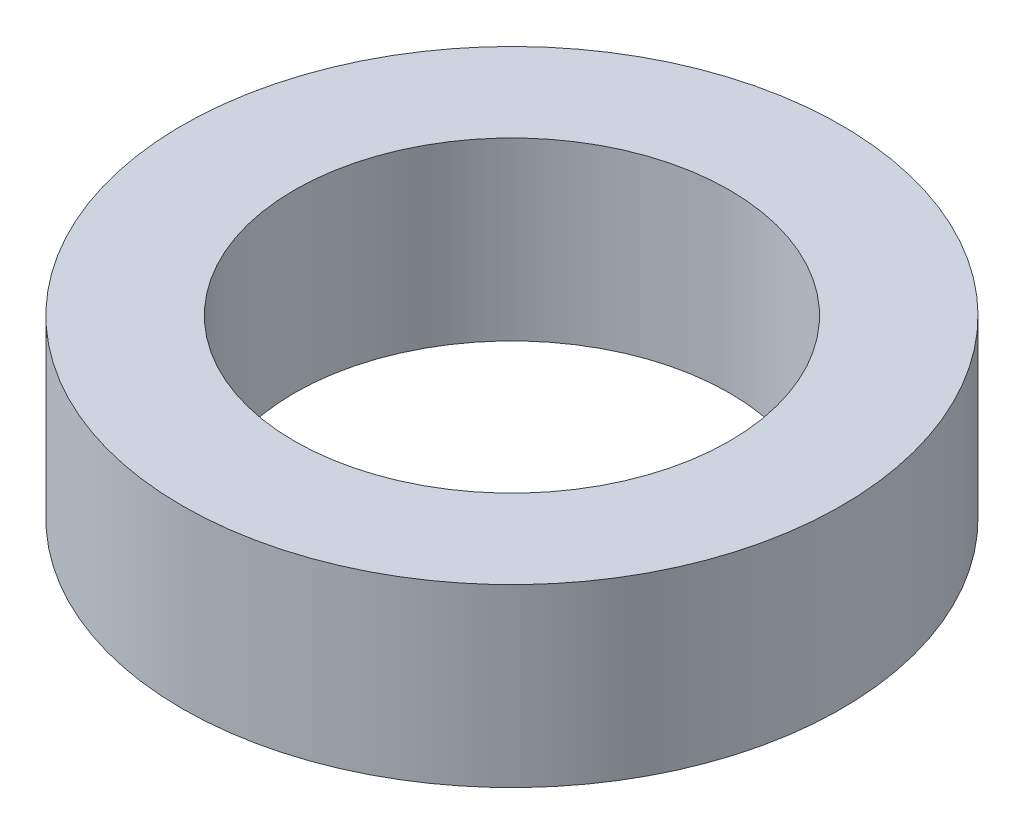
ISO-10303-21;
HEADER;
FILE_DESCRIPTION(('STEP AP214'),'2;1');
FILE_NAME('part.step','',(''),(''),'','','');
FILE_SCHEMA(('AUTOMOTIVE_DESIGN { 1 0 10303 214 1 1 1 1 }'));
ENDSEC;
DATA;
#1=APPLICATION_CONTEXT('core data for automotive mechanical design processes');
#2=APPLICATION_PROTOCOL_DEFINITION('international standard','automotive_design',2000,#1);
#3=PRODUCT_CONTEXT('',#1,'mechanical');
#4=PRODUCT('Part','Part','',(#3));
#5=PRODUCT_RELATED_PRODUCT_CATEGORY('part','',(#4));
#6=PRODUCT_DEFINITION_FORMATION('','',#4);
#7=PRODUCT_DEFINITION_CONTEXT('part definition',#1,'design');
#8=PRODUCT_DEFINITION('design','',#6,#7);
#9=PRODUCT_DEFINITION_SHAPE('','',#8);
#10=(LENGTH_UNIT() NAMED_UNIT(*) SI_UNIT(.MILLI.,.METRE.));
#11=(NAMED_UNIT(*) PLANE_ANGLE_UNIT() SI_UNIT($,.RADIAN.));
#12=(NAMED_UNIT(*) SI_UNIT($,.STERADIAN.) SOLID_ANGLE_UNIT());
#13=UNCERTAINTY_MEASURE_WITH_UNIT(LENGTH_MEASURE(1.E-05),#10,'distance_accuracy_value','');
#14=(GEOMETRIC_REPRESENTATION_CONTEXT(3) GLOBAL_UNCERTAINTY_ASSIGNED_CONTEXT((#13)) GLOBAL_UNIT_ASSIGNED_CONTEXT((#10,
#11,#12)) REPRESENTATION_CONTEXT('',''));
#15=CARTESIAN_POINT('',(0.,0.,0.));
#16=DIRECTION('',(0.,0.,1.));
#17=DIRECTION('',(1.,0.,0.));
#18=AXIS2_PLACEMENT_3D('',#15,#16,#17);
#19=CARTESIAN_POINT('',(0.,4.,0.));
#20=DIRECTION('',(0.,1.,0.));
#21=DIRECTION('',(0.,0.,1.));
#22=AXIS2_PLACEMENT_3D('',#19,#20,#21);
#23=PLANE('',#22);
#24=CARTESIAN_POINT('',(0.,4.,0.));
#25=DIRECTION('',(0.,1.,0.));
#26=DIRECTION('',(0.,0.,1.));
#27=AXIS2_PLACEMENT_3D('',#24,#25,#26);
#28=CIRCLE('',#27,7.5);
#29=CARTESIAN_POINT('',(0.,4.,7.5));
#30=VERTEX_POINT('',#29);
#31=EDGE_CURVE('E10',#30,#30,#28,.T.);
#32=ORIENTED_EDGE('',*,*,#31,.T.);
#33=EDGE_LOOP('',(#32));
#34=FACE_BOUND('',#33,.T.);
#35=CARTESIAN_POINT('',(0.,4.,0.));
#36=DIRECTION('',(0.,1.,0.));
#37=DIRECTION('',(0.,0.,1.));
#38=AXIS2_PLACEMENT_3D('',#35,#36,#37);
#39=CIRCLE('',#38,4.95);
#40=CARTESIAN_POINT('',(0.,4.,4.95));
#41=VERTEX_POINT('',#40);
#42=EDGE_CURVE('E42',#41,#41,#39,.T.);
#43=ORIENTED_EDGE('',*,*,#42,.F.);
#44=EDGE_LOOP('',(#43));
#45=FACE_BOUND('',#44,.T.);
#46=ADVANCED_FACE('F31',(#34,#45),#23,.T.);
#47=CARTESIAN_POINT('',(0.,0.,0.));
#48=DIRECTION('',(0.,1.,0.));
#49=DIRECTION('',(0.,0.,1.));
#50=AXIS2_PLACEMENT_3D('',#47,#48,#49);
#51=PLANE('',#50);
#52=CARTESIAN_POINT('',(0.,0.,0.));
#53=DIRECTION('',(0.,1.,0.));
#54=DIRECTION('',(0.,0.,1.));
#55=AXIS2_PLACEMENT_3D('',#52,#53,#54);
#56=CIRCLE('',#55,7.5);
#57=CARTESIAN_POINT('',(0.,0.,7.5));
#58=VERTEX_POINT('',#57);
#59=EDGE_CURVE('E35',#58,#58,#56,.T.);
#60=ORIENTED_EDGE('',*,*,#59,.F.);
#61=EDGE_LOOP('',(#60));
#62=FACE_BOUND('',#61,.T.);
#63=CARTESIAN_POINT('',(0.,0.,0.));
#64=DIRECTION('',(0.,1.,0.));
#65=DIRECTION('',(0.,0.,1.));
#66=AXIS2_PLACEMENT_3D('',#63,#64,#65);
#67=CIRCLE('',#66,4.95);
#68=CARTESIAN_POINT('',(0.,0.,4.95));
#69=VERTEX_POINT('',#68);
#70=EDGE_CURVE('E44',#69,#69,#67,.T.);
#71=ORIENTED_EDGE('',*,*,#70,.T.);
#72=EDGE_LOOP('',(#71));
#73=FACE_BOUND('',#72,.T.);
#74=ADVANCED_FACE('F54',(#62,#73),#51,.F.);
#75=CARTESIAN_POINT('',(0.,4.,0.));
#76=DIRECTION('',(0.,-1.,0.));
#77=DIRECTION('',(0.,0.,-1.));
#78=AXIS2_PLACEMENT_3D('',#75,#76,#77);
#79=CYLINDRICAL_SURFACE('',#78,7.5);
#80=ORIENTED_EDGE('',*,*,#31,.F.);
#81=EDGE_LOOP('',(#80));
#82=FACE_BOUND('',#81,.T.);
#83=ORIENTED_EDGE('',*,*,#59,.T.);
#84=EDGE_LOOP('',(#83));
#85=FACE_BOUND('',#84,.T.);
#86=ADVANCED_FACE('F33',(#82,#85),#79,.T.);
#87=CARTESIAN_POINT('',(0.,4.,0.));
#88=DIRECTION('',(0.,-1.,0.));
#89=DIRECTION('',(0.,0.,-1.));
#90=AXIS2_PLACEMENT_3D('',#87,#88,#89);
#91=CYLINDRICAL_SURFACE('',#90,4.95);
#92=ORIENTED_EDGE('',*,*,#42,.T.);
#93=EDGE_LOOP('',(#92));
#94=FACE_BOUND('',#93,.T.);
#95=ORIENTED_EDGE('',*,*,#70,.F.);
#96=EDGE_LOOP('',(#95));
#97=FACE_BOUND('',#96,.T.);
#98=ADVANCED_FACE('F50',(#94,#97),#91,.F.);
#99=CLOSED_SHELL('',(#46,#74,#86,#98));
#100=MANIFOLD_SOLID_BREP('B2',#99);
#101=ADVANCED_BREP_SHAPE_REPRESENTATION('',(#18,#100),#14);
#102=SHAPE_DEFINITION_REPRESENTATION(#9,#101);
ENDSEC;
END-ISO-10303-21;
